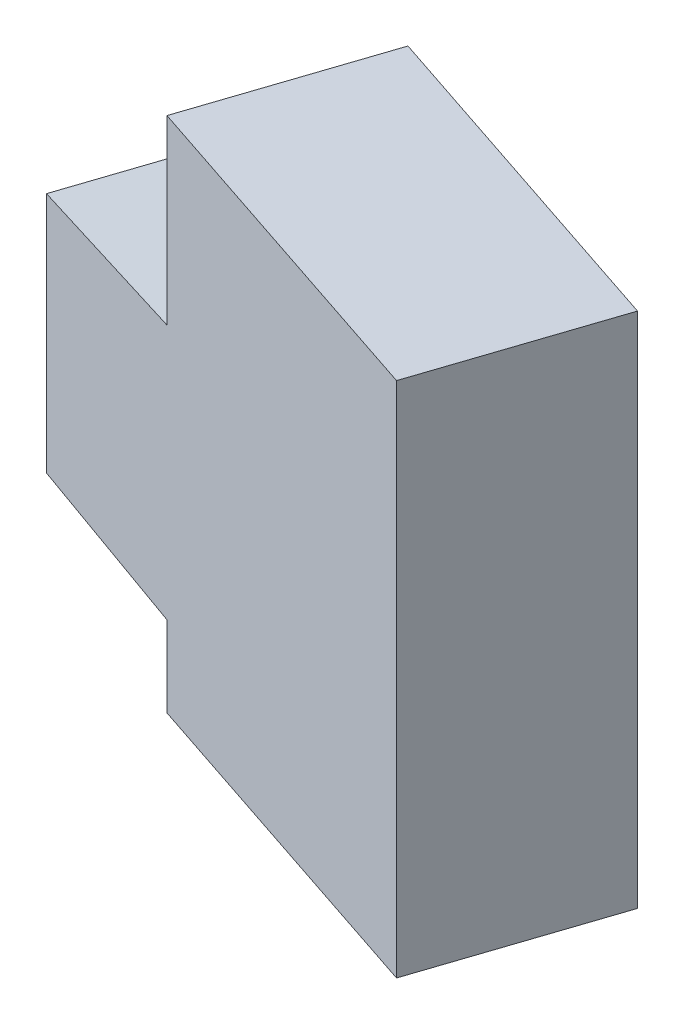
ISO-10303-21;
HEADER;
FILE_DESCRIPTION(('STEP AP214'),'2;1');
FILE_NAME('part.step','',(''),(''),'','','');
FILE_SCHEMA(('AUTOMOTIVE_DESIGN { 1 0 10303 214 1 1 1 1 }'));
ENDSEC;
DATA;
#1=APPLICATION_CONTEXT('core data for automotive mechanical design processes');
#2=APPLICATION_PROTOCOL_DEFINITION('international standard','automotive_design',2000,#1);
#3=PRODUCT_CONTEXT('',#1,'mechanical');
#4=PRODUCT('Part','Part','',(#3));
#5=PRODUCT_RELATED_PRODUCT_CATEGORY('part','',(#4));
#6=PRODUCT_DEFINITION_FORMATION('','',#4);
#7=PRODUCT_DEFINITION_CONTEXT('part definition',#1,'design');
#8=PRODUCT_DEFINITION('design','',#6,#7);
#9=PRODUCT_DEFINITION_SHAPE('','',#8);
#10=(LENGTH_UNIT() NAMED_UNIT(*) SI_UNIT(.MILLI.,.METRE.));
#11=(NAMED_UNIT(*) PLANE_ANGLE_UNIT() SI_UNIT($,.RADIAN.));
#12=(NAMED_UNIT(*) SI_UNIT($,.STERADIAN.) SOLID_ANGLE_UNIT());
#13=UNCERTAINTY_MEASURE_WITH_UNIT(LENGTH_MEASURE(1.E-05),#10,'distance_accuracy_value','');
#14=(GEOMETRIC_REPRESENTATION_CONTEXT(3) GLOBAL_UNCERTAINTY_ASSIGNED_CONTEXT((#13)) GLOBAL_UNIT_ASSIGNED_CONTEXT((#10,
#11,#12)) REPRESENTATION_CONTEXT('',''));
#15=CARTESIAN_POINT('',(0.,0.,0.));
#16=DIRECTION('',(0.,0.,1.));
#17=DIRECTION('',(1.,0.,0.));
#18=AXIS2_PLACEMENT_3D('',#15,#16,#17);
#19=CARTESIAN_POINT('',(-50.218433827293,217.8812,7.58946638440441));
#20=DIRECTION('',(0.948683298050514,0.,0.316227766016838));
#21=DIRECTION('',(0.316227766016838,0.,-0.948683298050514));
#22=AXIS2_PLACEMENT_3D('',#19,#20,#21);
#23=PLANE('',#22);
#24=DIRECTION('',(0.,-1.,0.));
#25=VECTOR('',#24,1.);
#26=CARTESIAN_POINT('',(-48.3210672311919,217.8812,1.89736659610133));
#27=LINE('',#26,#25);
#28=CARTESIAN_POINT('',(-48.3210672311919,223.5962,1.89736659610133));
#29=VERTEX_POINT('',#28);
#30=CARTESIAN_POINT('',(-48.3210672311919,217.8812,1.89736659610133));
#31=VERTEX_POINT('',#30);
#32=EDGE_CURVE('E92',#29,#31,#27,.T.);
#33=ORIENTED_EDGE('',*,*,#32,.T.);
#34=DIRECTION('',(0.316227766016838,0.,-0.948683298050514));
#35=VECTOR('',#34,1.);
#36=CARTESIAN_POINT('',(-50.218433827293,217.8812,7.58946638440441));
#37=LINE('',#36,#35);
#38=CARTESIAN_POINT('',(-50.218433827293,217.8812,7.58946638440441));
#39=VERTEX_POINT('',#38);
#40=EDGE_CURVE('E11',#39,#31,#37,.T.);
#41=ORIENTED_EDGE('',*,*,#40,.F.);
#42=DIRECTION('',(0.,-1.,0.));
#43=VECTOR('',#42,1.);
#44=CARTESIAN_POINT('',(-50.218433827293,220.4212,7.58946638440441));
#45=LINE('',#44,#43);
#46=CARTESIAN_POINT('',(-50.218433827293,223.5962,7.58946638440441));
#47=VERTEX_POINT('',#46);
#48=EDGE_CURVE('E98',#47,#39,#45,.T.);
#49=ORIENTED_EDGE('',*,*,#48,.F.);
#50=DIRECTION('',(0.316227766016838,0.,-0.948683298050514));
#51=VECTOR('',#50,1.);
#52=CARTESIAN_POINT('',(-50.218433827293,223.5962,7.58946638440441));
#53=LINE('',#52,#51);
#54=EDGE_CURVE('E136',#47,#29,#53,.T.);
#55=ORIENTED_EDGE('',*,*,#54,.T.);
#56=EDGE_LOOP('',(#33,#41,#49,#55));
#57=FACE_BOUND('',#56,.T.);
#58=ADVANCED_FACE('F39',(#57),#23,.F.);
#59=CARTESIAN_POINT('',(-55.910533615596,217.671675383049,5.69209978830339));
#60=DIRECTION('',(0.033108569632061,-0.999390827019095,0.0110361898773544));
#61=DIRECTION('',(0.999451694224891,0.033110586086552,0.));
#62=AXIS2_PLACEMENT_3D('',#59,#60,#61);
#63=PLANE('',#62);
#64=DIRECTION('',(-0.948105385817905,-0.0348994967025322,-0.316035128605969));
#65=VECTOR('',#64,1.);
#66=CARTESIAN_POINT('',(-54.013167019495,217.671675383049,3.04877650902924E-13));
#67=LINE('',#66,#65);
#68=CARTESIAN_POINT('',(-54.013167019495,217.671675383049,3.04877650902924E-13));
#69=VERTEX_POINT('',#68);
#70=EDGE_CURVE('E142',#31,#69,#67,.T.);
#71=ORIENTED_EDGE('',*,*,#70,.T.);
#72=DIRECTION('',(0.316227766016838,0.,-0.948683298050514));
#73=VECTOR('',#72,1.);
#74=CARTESIAN_POINT('',(-55.910533615596,217.671675383049,5.69209978830339));
#75=LINE('',#74,#73);
#76=CARTESIAN_POINT('',(-55.910533615596,217.671675383049,5.69209978830339));
#77=VERTEX_POINT('',#76);
#78=EDGE_CURVE('E48',#77,#69,#75,.T.);
#79=ORIENTED_EDGE('',*,*,#78,.F.);
#80=DIRECTION('',(-0.948105385817905,-0.0348994967025322,-0.316035128605969));
#81=VECTOR('',#80,1.);
#82=CARTESIAN_POINT('',(-55.910533615596,217.671675383049,5.69209978830339));
#83=LINE('',#82,#81);
#84=EDGE_CURVE('E202',#39,#77,#83,.T.);
#85=ORIENTED_EDGE('',*,*,#84,.F.);
#86=ORIENTED_EDGE('',*,*,#40,.T.);
#87=EDGE_LOOP('',(#71,#79,#85,#86));
#88=FACE_BOUND('',#87,.T.);
#89=ADVANCED_FACE('F206',(#88),#63,.F.);
#90=CARTESIAN_POINT('',(-55.910533615596,210.051675383049,5.69209978830339));
#91=DIRECTION('',(0.948683298050514,0.,0.316227766016838));
#92=DIRECTION('',(0.316227766016838,0.,-0.948683298050514));
#93=AXIS2_PLACEMENT_3D('',#90,#91,#92);
#94=PLANE('',#93);
#95=DIRECTION('',(0.,-1.,0.));
#96=VECTOR('',#95,1.);
#97=CARTESIAN_POINT('',(-54.013167019495,210.051675383049,3.11816544806831E-13));
#98=LINE('',#97,#96);
#99=CARTESIAN_POINT('',(-54.013167019495,210.051675383049,3.11816544806831E-13));
#100=VERTEX_POINT('',#99);
#101=EDGE_CURVE('E145',#69,#100,#98,.T.);
#102=ORIENTED_EDGE('',*,*,#101,.T.);
#103=DIRECTION('',(0.316227766016838,0.,-0.948683298050514));
#104=VECTOR('',#103,1.);
#105=CARTESIAN_POINT('',(-55.910533615596,210.051675383049,5.69209978830339));
#106=LINE('',#105,#104);
#107=CARTESIAN_POINT('',(-55.910533615596,210.051675383049,5.69209978830339));
#108=VERTEX_POINT('',#107);
#109=EDGE_CURVE('E172',#108,#100,#106,.T.);
#110=ORIENTED_EDGE('',*,*,#109,.F.);
#111=DIRECTION('',(0.,-1.,0.));
#112=VECTOR('',#111,1.);
#113=CARTESIAN_POINT('',(-55.910533615596,210.051675383049,5.69209978830339));
#114=LINE('',#113,#112);
#115=EDGE_CURVE('E183',#77,#108,#114,.T.);
#116=ORIENTED_EDGE('',*,*,#115,.F.);
#117=ORIENTED_EDGE('',*,*,#78,.T.);
#118=EDGE_LOOP('',(#102,#110,#116,#117));
#119=FACE_BOUND('',#118,.T.);
#120=ADVANCED_FACE('F181',(#119),#94,.F.);
#121=CARTESIAN_POINT('',(-50.218433827293,209.842150766099,7.58946638440442));
#122=DIRECTION('',(0.0331085696320264,0.999390827019096,0.0110361898773414));
#123=DIRECTION('',(-0.999451694224892,0.0331105860865174,0.));
#124=AXIS2_PLACEMENT_3D('',#121,#122,#123);
#125=PLANE('',#124);
#126=DIRECTION('',(0.948105385817906,-0.0348994967024952,0.316035128605969));
#127=VECTOR('',#126,1.);
#128=CARTESIAN_POINT('',(-48.3210672311919,209.842150766099,1.89736659610134));
#129=LINE('',#128,#127);
#130=CARTESIAN_POINT('',(-48.3210672311919,209.842150766099,1.89736659610134));
#131=VERTEX_POINT('',#130);
#132=EDGE_CURVE('E148',#100,#131,#129,.T.);
#133=ORIENTED_EDGE('',*,*,#132,.T.);
#134=DIRECTION('',(0.316227766016838,0.,-0.948683298050514));
#135=VECTOR('',#134,1.);
#136=CARTESIAN_POINT('',(-50.218433827293,209.842150766099,7.58946638440442));
#137=LINE('',#136,#135);
#138=CARTESIAN_POINT('',(-50.218433827293,209.842150766099,7.58946638440442));
#139=VERTEX_POINT('',#138);
#140=EDGE_CURVE('E168',#139,#131,#137,.T.);
#141=ORIENTED_EDGE('',*,*,#140,.F.);
#142=DIRECTION('',(0.948105385817906,-0.0348994967024952,0.316035128605969));
#143=VECTOR('',#142,1.);
#144=CARTESIAN_POINT('',(-50.218433827293,209.842150766099,7.58946638440442));
#145=LINE('',#144,#143);
#146=EDGE_CURVE('E196',#108,#139,#145,.T.);
#147=ORIENTED_EDGE('',*,*,#146,.F.);
#148=ORIENTED_EDGE('',*,*,#109,.T.);
#149=EDGE_LOOP('',(#133,#141,#147,#148));
#150=FACE_BOUND('',#149,.T.);
#151=ADVANCED_FACE('F191',(#150),#125,.F.);
#152=CARTESIAN_POINT('',(-50.2184338272929,207.302150766099,7.58946638440442));
#153=DIRECTION('',(0.948683298050514,0.,0.316227766016838));
#154=DIRECTION('',(0.316227766016838,0.,-0.948683298050514));
#155=AXIS2_PLACEMENT_3D('',#152,#153,#154);
#156=PLANE('',#155);
#157=DIRECTION('',(0.,-1.,0.));
#158=VECTOR('',#157,1.);
#159=CARTESIAN_POINT('',(-48.3210672311919,207.302150766099,1.89736659610134));
#160=LINE('',#159,#158);
#161=CARTESIAN_POINT('',(-48.3210672311919,207.302150766099,1.89736659610134));
#162=VERTEX_POINT('',#161);
#163=EDGE_CURVE('E151',#131,#162,#160,.T.);
#164=ORIENTED_EDGE('',*,*,#163,.T.);
#165=DIRECTION('',(0.316227766016838,0.,-0.948683298050514));
#166=VECTOR('',#165,1.);
#167=CARTESIAN_POINT('',(-50.2184338272929,207.302150766099,7.58946638440442));
#168=LINE('',#167,#166);
#169=CARTESIAN_POINT('',(-50.2184338272929,207.302150766099,7.58946638440442));
#170=VERTEX_POINT('',#169);
#171=EDGE_CURVE('E129',#170,#162,#168,.T.);
#172=ORIENTED_EDGE('',*,*,#171,.F.);
#173=DIRECTION('',(0.,-1.,0.));
#174=VECTOR('',#173,1.);
#175=CARTESIAN_POINT('',(-50.2184338272929,207.302150766099,7.58946638440442));
#176=LINE('',#175,#174);
#177=EDGE_CURVE('E118',#139,#170,#176,.T.);
#178=ORIENTED_EDGE('',*,*,#177,.F.);
#179=ORIENTED_EDGE('',*,*,#140,.T.);
#180=EDGE_LOOP('',(#164,#172,#178,#179));
#181=FACE_BOUND('',#180,.T.);
#182=ADVANCED_FACE('F194',(#181),#156,.F.);
#183=CARTESIAN_POINT('',(-39.3749837305756,207.302150766099,11.2039497499769));
#184=DIRECTION('',(0.,1.,0.));
#185=DIRECTION('',(0.,0.,1.));
#186=AXIS2_PLACEMENT_3D('',#183,#184,#185);
#187=PLANE('',#186);
#188=DIRECTION('',(0.948683298050514,0.,0.316227766016838));
#189=VECTOR('',#188,1.);
#190=CARTESIAN_POINT('',(-37.4776171344746,207.302150766099,5.5118499616738));
#191=LINE('',#190,#189);
#192=CARTESIAN_POINT('',(-37.4776171344746,207.302150766099,5.5118499616738));
#193=VERTEX_POINT('',#192);
#194=EDGE_CURVE('E127',#162,#193,#191,.T.);
#195=ORIENTED_EDGE('',*,*,#194,.T.);
#196=DIRECTION('',(0.316227766016838,0.,-0.948683298050514));
#197=VECTOR('',#196,1.);
#198=CARTESIAN_POINT('',(-39.3749837305756,207.302150766099,11.2039497499769));
#199=LINE('',#198,#197);
#200=CARTESIAN_POINT('',(-39.3749837305756,207.302150766099,11.2039497499769));
#201=VERTEX_POINT('',#200);
#202=EDGE_CURVE('E124',#201,#193,#199,.T.);
#203=ORIENTED_EDGE('',*,*,#202,.F.);
#204=DIRECTION('',(0.948683298050514,0.,0.316227766016838));
#205=VECTOR('',#204,1.);
#206=CARTESIAN_POINT('',(-39.3749837305756,207.302150766099,11.2039497499769));
#207=LINE('',#206,#205);
#208=EDGE_CURVE('E112',#170,#201,#207,.T.);
#209=ORIENTED_EDGE('',*,*,#208,.F.);
#210=ORIENTED_EDGE('',*,*,#171,.T.);
#211=EDGE_LOOP('',(#195,#203,#209,#210));
#212=FACE_BOUND('',#211,.T.);
#213=ADVANCED_FACE('F125',(#212),#187,.F.);
#214=CARTESIAN_POINT('',(-39.3749837305756,223.5962,11.2039497499769));
#215=DIRECTION('',(-0.948683298050514,0.,-0.316227766016838));
#216=DIRECTION('',(-0.316227766016838,0.,0.948683298050514));
#217=AXIS2_PLACEMENT_3D('',#214,#215,#216);
#218=PLANE('',#217);
#219=DIRECTION('',(0.,1.,0.));
#220=VECTOR('',#219,1.);
#221=CARTESIAN_POINT('',(-37.4776171344746,223.5962,5.51184996167378));
#222=LINE('',#221,#220);
#223=CARTESIAN_POINT('',(-37.4776171344746,223.5962,5.51184996167378));
#224=VERTEX_POINT('',#223);
#225=EDGE_CURVE('E85',#193,#224,#222,.T.);
#226=ORIENTED_EDGE('',*,*,#225,.T.);
#227=DIRECTION('',(0.316227766016838,0.,-0.948683298050514));
#228=VECTOR('',#227,1.);
#229=CARTESIAN_POINT('',(-39.3749837305756,223.5962,11.2039497499769));
#230=LINE('',#229,#228);
#231=CARTESIAN_POINT('',(-39.3749837305756,223.5962,11.2039497499769));
#232=VERTEX_POINT('',#231);
#233=EDGE_CURVE('E130',#232,#224,#230,.T.);
#234=ORIENTED_EDGE('',*,*,#233,.F.);
#235=DIRECTION('',(0.,1.,0.));
#236=VECTOR('',#235,1.);
#237=CARTESIAN_POINT('',(-39.3749837305756,223.5962,11.2039497499769));
#238=LINE('',#237,#236);
#239=EDGE_CURVE('E116',#201,#232,#238,.T.);
#240=ORIENTED_EDGE('',*,*,#239,.F.);
#241=ORIENTED_EDGE('',*,*,#202,.T.);
#242=EDGE_LOOP('',(#226,#234,#240,#241));
#243=FACE_BOUND('',#242,.T.);
#244=ADVANCED_FACE('F132',(#243),#218,.F.);
#245=CARTESIAN_POINT('',(-50.218433827293,223.5962,7.58946638440441));
#246=DIRECTION('',(0.,-1.,0.));
#247=DIRECTION('',(0.,0.,-1.));
#248=AXIS2_PLACEMENT_3D('',#245,#246,#247);
#249=PLANE('',#248);
#250=DIRECTION('',(-0.948683298050514,0.,-0.316227766016838));
#251=VECTOR('',#250,1.);
#252=CARTESIAN_POINT('',(-48.3210672311919,223.5962,1.89736659610133));
#253=LINE('',#252,#251);
#254=EDGE_CURVE('E158',#224,#29,#253,.T.);
#255=ORIENTED_EDGE('',*,*,#254,.T.);
#256=ORIENTED_EDGE('',*,*,#54,.F.);
#257=DIRECTION('',(-0.948683298050514,0.,-0.316227766016838));
#258=VECTOR('',#257,1.);
#259=CARTESIAN_POINT('',(-50.218433827293,223.5962,7.58946638440441));
#260=LINE('',#259,#258);
#261=EDGE_CURVE('E56',#232,#47,#260,.T.);
#262=ORIENTED_EDGE('',*,*,#261,.F.);
#263=ORIENTED_EDGE('',*,*,#233,.T.);
#264=EDGE_LOOP('',(#255,#256,#262,#263));
#265=FACE_BOUND('',#264,.T.);
#266=ADVANCED_FACE('F209',(#265),#249,.F.);
#267=CARTESIAN_POINT('',(-7.2986832980507,0.,21.8960498941521));
#268=DIRECTION('',(0.316227766016838,0.,-0.948683298050514));
#269=DIRECTION('',(-0.948683298050514,0.,-0.316227766016838));
#270=AXIS2_PLACEMENT_3D('',#267,#268,#269);
#271=PLANE('',#270);
#272=ORIENTED_EDGE('',*,*,#48,.T.);
#273=ORIENTED_EDGE('',*,*,#84,.T.);
#274=ORIENTED_EDGE('',*,*,#115,.T.);
#275=ORIENTED_EDGE('',*,*,#146,.T.);
#276=ORIENTED_EDGE('',*,*,#177,.T.);
#277=ORIENTED_EDGE('',*,*,#208,.T.);
#278=ORIENTED_EDGE('',*,*,#239,.T.);
#279=ORIENTED_EDGE('',*,*,#261,.T.);
#280=EDGE_LOOP('',(#272,#273,#274,#275,#276,#277,#278,#279));
#281=FACE_BOUND('',#280,.T.);
#282=ADVANCED_FACE('F114',(#281),#271,.F.);
#283=CARTESIAN_POINT('',(-5.40131670194967,0.,16.203950105849));
#284=DIRECTION('',(0.316227766016838,0.,-0.948683298050514));
#285=DIRECTION('',(-0.948683298050514,0.,-0.316227766016838));
#286=AXIS2_PLACEMENT_3D('',#283,#284,#285);
#287=PLANE('',#286);
#288=ORIENTED_EDGE('',*,*,#32,.F.);
#289=ORIENTED_EDGE('',*,*,#254,.F.);
#290=ORIENTED_EDGE('',*,*,#225,.F.);
#291=ORIENTED_EDGE('',*,*,#194,.F.);
#292=ORIENTED_EDGE('',*,*,#163,.F.);
#293=ORIENTED_EDGE('',*,*,#132,.F.);
#294=ORIENTED_EDGE('',*,*,#101,.F.);
#295=ORIENTED_EDGE('',*,*,#70,.F.);
#296=EDGE_LOOP('',(#288,#289,#290,#291,#292,#293,#294,#295));
#297=FACE_BOUND('',#296,.T.);
#298=ADVANCED_FACE('F187',(#297),#287,.T.);
#299=CLOSED_SHELL('',(#58,#89,#120,#151,#182,#213,#244,#266,#282,#298));
#300=MANIFOLD_SOLID_BREP('B2',#299);
#301=ADVANCED_BREP_SHAPE_REPRESENTATION('',(#18,#300),#14);
#302=SHAPE_DEFINITION_REPRESENTATION(#9,#301);
ENDSEC;
END-ISO-10303-21;
